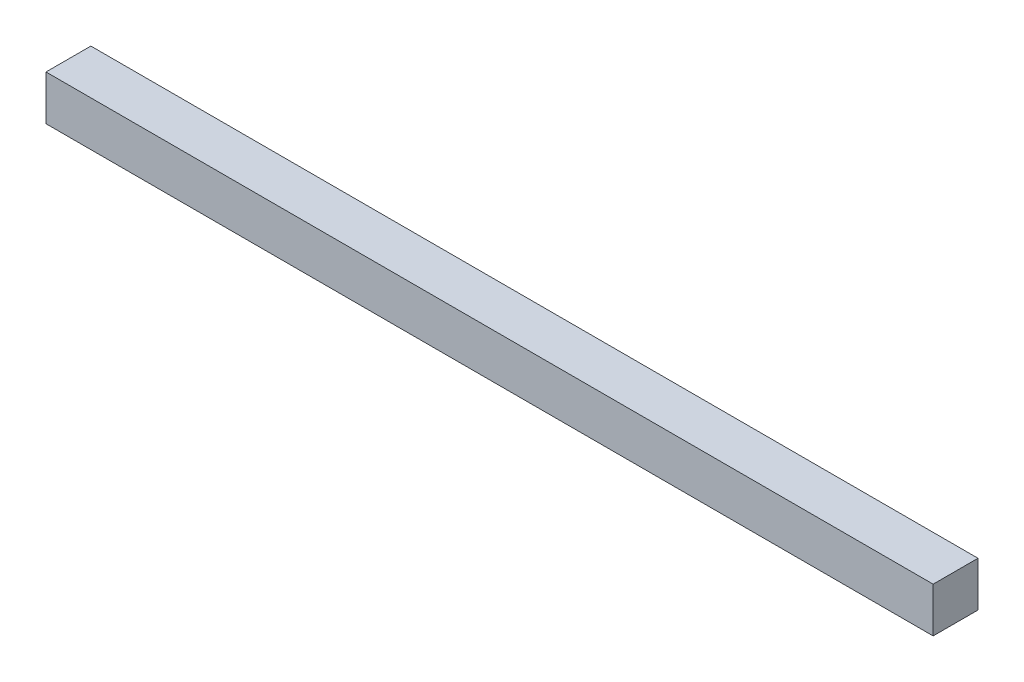
ISO-10303-21;
HEADER;
FILE_DESCRIPTION(('STEP AP214'),'2;1');
FILE_NAME('part.step','',(''),(''),'','','');
FILE_SCHEMA(('AUTOMOTIVE_DESIGN { 1 0 10303 214 1 1 1 1 }'));
ENDSEC;
DATA;
#1=APPLICATION_CONTEXT('core data for automotive mechanical design processes');
#2=APPLICATION_PROTOCOL_DEFINITION('international standard','automotive_design',2000,#1);
#3=PRODUCT_CONTEXT('',#1,'mechanical');
#4=PRODUCT('Part','Part','',(#3));
#5=PRODUCT_RELATED_PRODUCT_CATEGORY('part','',(#4));
#6=PRODUCT_DEFINITION_FORMATION('','',#4);
#7=PRODUCT_DEFINITION_CONTEXT('part definition',#1,'design');
#8=PRODUCT_DEFINITION('design','',#6,#7);
#9=PRODUCT_DEFINITION_SHAPE('','',#8);
#10=(LENGTH_UNIT() NAMED_UNIT(*) SI_UNIT(.MILLI.,.METRE.));
#11=(NAMED_UNIT(*) PLANE_ANGLE_UNIT() SI_UNIT($,.RADIAN.));
#12=(NAMED_UNIT(*) SI_UNIT($,.STERADIAN.) SOLID_ANGLE_UNIT());
#13=UNCERTAINTY_MEASURE_WITH_UNIT(LENGTH_MEASURE(1.E-05),#10,'distance_accuracy_value','');
#14=(GEOMETRIC_REPRESENTATION_CONTEXT(3) GLOBAL_UNCERTAINTY_ASSIGNED_CONTEXT((#13)) GLOBAL_UNIT_ASSIGNED_CONTEXT((#10,
#11,#12)) REPRESENTATION_CONTEXT('',''));
#15=CARTESIAN_POINT('',(0.,0.,0.));
#16=DIRECTION('',(0.,0.,1.));
#17=DIRECTION('',(1.,0.,0.));
#18=AXIS2_PLACEMENT_3D('',#15,#16,#17);
#19=CARTESIAN_POINT('',(89.,-4.5,-4.5));
#20=DIRECTION('',(0.,0.,1.));
#21=DIRECTION('',(1.,0.,0.));
#22=AXIS2_PLACEMENT_3D('',#19,#20,#21);
#23=PLANE('',#22);
#24=DIRECTION('',(-1.,0.,0.));
#25=VECTOR('',#24,1.);
#26=CARTESIAN_POINT('',(89.,-4.5,-4.5));
#27=LINE('',#26,#25);
#28=CARTESIAN_POINT('',(89.,-4.5,-4.5));
#29=VERTEX_POINT('',#28);
#30=CARTESIAN_POINT('',(-89.,-4.5,-4.5));
#31=VERTEX_POINT('',#30);
#32=EDGE_CURVE('E89',#29,#31,#27,.T.);
#33=ORIENTED_EDGE('',*,*,#32,.T.);
#34=DIRECTION('',(0.,1.,0.));
#35=VECTOR('',#34,1.);
#36=CARTESIAN_POINT('',(-89.,-4.5,-4.5));
#37=LINE('',#36,#35);
#38=CARTESIAN_POINT('',(-89.,4.5,-4.5));
#39=VERTEX_POINT('',#38);
#40=EDGE_CURVE('E84',#31,#39,#37,.T.);
#41=ORIENTED_EDGE('',*,*,#40,.T.);
#42=DIRECTION('',(-1.,0.,0.));
#43=VECTOR('',#42,1.);
#44=CARTESIAN_POINT('',(89.,4.5,-4.5));
#45=LINE('',#44,#43);
#46=CARTESIAN_POINT('',(89.,4.5,-4.5));
#47=VERTEX_POINT('',#46);
#48=EDGE_CURVE('E11',#47,#39,#45,.T.);
#49=ORIENTED_EDGE('',*,*,#48,.F.);
#50=DIRECTION('',(0.,1.,0.));
#51=VECTOR('',#50,1.);
#52=CARTESIAN_POINT('',(89.,-4.5,-4.5));
#53=LINE('',#52,#51);
#54=EDGE_CURVE('E95',#29,#47,#53,.T.);
#55=ORIENTED_EDGE('',*,*,#54,.F.);
#56=EDGE_LOOP('',(#33,#41,#49,#55));
#57=FACE_BOUND('',#56,.T.);
#58=ADVANCED_FACE('F32',(#57),#23,.F.);
#59=CARTESIAN_POINT('',(89.,4.5,4.5));
#60=DIRECTION('',(0.,-1.,0.));
#61=DIRECTION('',(0.,0.,-1.));
#62=AXIS2_PLACEMENT_3D('',#59,#60,#61);
#63=PLANE('',#62);
#64=ORIENTED_EDGE('',*,*,#48,.T.);
#65=DIRECTION('',(0.,0.,1.));
#66=VECTOR('',#65,1.);
#67=CARTESIAN_POINT('',(-89.,4.5,4.5));
#68=LINE('',#67,#66);
#69=CARTESIAN_POINT('',(-89.,4.5,4.5));
#70=VERTEX_POINT('',#69);
#71=EDGE_CURVE('E74',#39,#70,#68,.T.);
#72=ORIENTED_EDGE('',*,*,#71,.T.);
#73=DIRECTION('',(-1.,0.,0.));
#74=VECTOR('',#73,1.);
#75=CARTESIAN_POINT('',(89.,4.5,4.5));
#76=LINE('',#75,#74);
#77=CARTESIAN_POINT('',(89.,4.5,4.5));
#78=VERTEX_POINT('',#77);
#79=EDGE_CURVE('E39',#78,#70,#76,.T.);
#80=ORIENTED_EDGE('',*,*,#79,.F.);
#81=DIRECTION('',(0.,0.,1.));
#82=VECTOR('',#81,1.);
#83=CARTESIAN_POINT('',(89.,4.5,4.5));
#84=LINE('',#83,#82);
#85=EDGE_CURVE('E75',#47,#78,#84,.T.);
#86=ORIENTED_EDGE('',*,*,#85,.F.);
#87=EDGE_LOOP('',(#64,#72,#80,#86));
#88=FACE_BOUND('',#87,.T.);
#89=ADVANCED_FACE('F72',(#88),#63,.F.);
#90=CARTESIAN_POINT('',(89.,-4.5,4.5));
#91=DIRECTION('',(0.,0.,-1.));
#92=DIRECTION('',(-1.,0.,0.));
#93=AXIS2_PLACEMENT_3D('',#90,#91,#92);
#94=PLANE('',#93);
#95=ORIENTED_EDGE('',*,*,#79,.T.);
#96=DIRECTION('',(0.,-1.,0.));
#97=VECTOR('',#96,1.);
#98=CARTESIAN_POINT('',(-89.,-4.5,4.5));
#99=LINE('',#98,#97);
#100=CARTESIAN_POINT('',(-89.,-4.5,4.5));
#101=VERTEX_POINT('',#100);
#102=EDGE_CURVE('E87',#70,#101,#99,.T.);
#103=ORIENTED_EDGE('',*,*,#102,.T.);
#104=DIRECTION('',(-1.,0.,0.));
#105=VECTOR('',#104,1.);
#106=CARTESIAN_POINT('',(89.,-4.5,4.5));
#107=LINE('',#106,#105);
#108=CARTESIAN_POINT('',(89.,-4.5,4.5));
#109=VERTEX_POINT('',#108);
#110=EDGE_CURVE('E101',#109,#101,#107,.T.);
#111=ORIENTED_EDGE('',*,*,#110,.F.);
#112=DIRECTION('',(0.,-1.,0.));
#113=VECTOR('',#112,1.);
#114=CARTESIAN_POINT('',(89.,-4.5,4.5));
#115=LINE('',#114,#113);
#116=EDGE_CURVE('E51',#78,#109,#115,.T.);
#117=ORIENTED_EDGE('',*,*,#116,.F.);
#118=EDGE_LOOP('',(#95,#103,#111,#117));
#119=FACE_BOUND('',#118,.T.);
#120=ADVANCED_FACE('F103',(#119),#94,.F.);
#121=CARTESIAN_POINT('',(89.,-4.5,4.5));
#122=DIRECTION('',(0.,1.,0.));
#123=DIRECTION('',(0.,0.,1.));
#124=AXIS2_PLACEMENT_3D('',#121,#122,#123);
#125=PLANE('',#124);
#126=ORIENTED_EDGE('',*,*,#110,.T.);
#127=DIRECTION('',(0.,0.,-1.));
#128=VECTOR('',#127,1.);
#129=CARTESIAN_POINT('',(-89.,-4.5,4.5));
#130=LINE('',#129,#128);
#131=EDGE_CURVE('E93',#101,#31,#130,.T.);
#132=ORIENTED_EDGE('',*,*,#131,.T.);
#133=ORIENTED_EDGE('',*,*,#32,.F.);
#134=DIRECTION('',(0.,0.,-1.));
#135=VECTOR('',#134,1.);
#136=CARTESIAN_POINT('',(89.,-4.5,4.5));
#137=LINE('',#136,#135);
#138=EDGE_CURVE('E46',#109,#29,#137,.T.);
#139=ORIENTED_EDGE('',*,*,#138,.F.);
#140=EDGE_LOOP('',(#126,#132,#133,#139));
#141=FACE_BOUND('',#140,.T.);
#142=ADVANCED_FACE('F105',(#141),#125,.F.);
#143=CARTESIAN_POINT('',(89.,0.,0.));
#144=DIRECTION('',(-1.,0.,0.));
#145=DIRECTION('',(0.,0.,1.));
#146=AXIS2_PLACEMENT_3D('',#143,#144,#145);
#147=PLANE('',#146);
#148=ORIENTED_EDGE('',*,*,#54,.T.);
#149=ORIENTED_EDGE('',*,*,#85,.T.);
#150=ORIENTED_EDGE('',*,*,#116,.T.);
#151=ORIENTED_EDGE('',*,*,#138,.T.);
#152=EDGE_LOOP('',(#148,#149,#150,#151));
#153=FACE_BOUND('',#152,.T.);
#154=ADVANCED_FACE('F106',(#153),#147,.F.);
#155=CARTESIAN_POINT('',(-89.,0.,0.));
#156=DIRECTION('',(-1.,0.,0.));
#157=DIRECTION('',(0.,0.,1.));
#158=AXIS2_PLACEMENT_3D('',#155,#156,#157);
#159=PLANE('',#158);
#160=ORIENTED_EDGE('',*,*,#40,.F.);
#161=ORIENTED_EDGE('',*,*,#131,.F.);
#162=ORIENTED_EDGE('',*,*,#102,.F.);
#163=ORIENTED_EDGE('',*,*,#71,.F.);
#164=EDGE_LOOP('',(#160,#161,#162,#163));
#165=FACE_BOUND('',#164,.T.);
#166=ADVANCED_FACE('F82',(#165),#159,.T.);
#167=CLOSED_SHELL('',(#58,#89,#120,#142,#154,#166));
#168=MANIFOLD_SOLID_BREP('B2',#167);
#169=ADVANCED_BREP_SHAPE_REPRESENTATION('',(#18,#168),#14);
#170=SHAPE_DEFINITION_REPRESENTATION(#9,#169);
ENDSEC;
END-ISO-10303-21;
